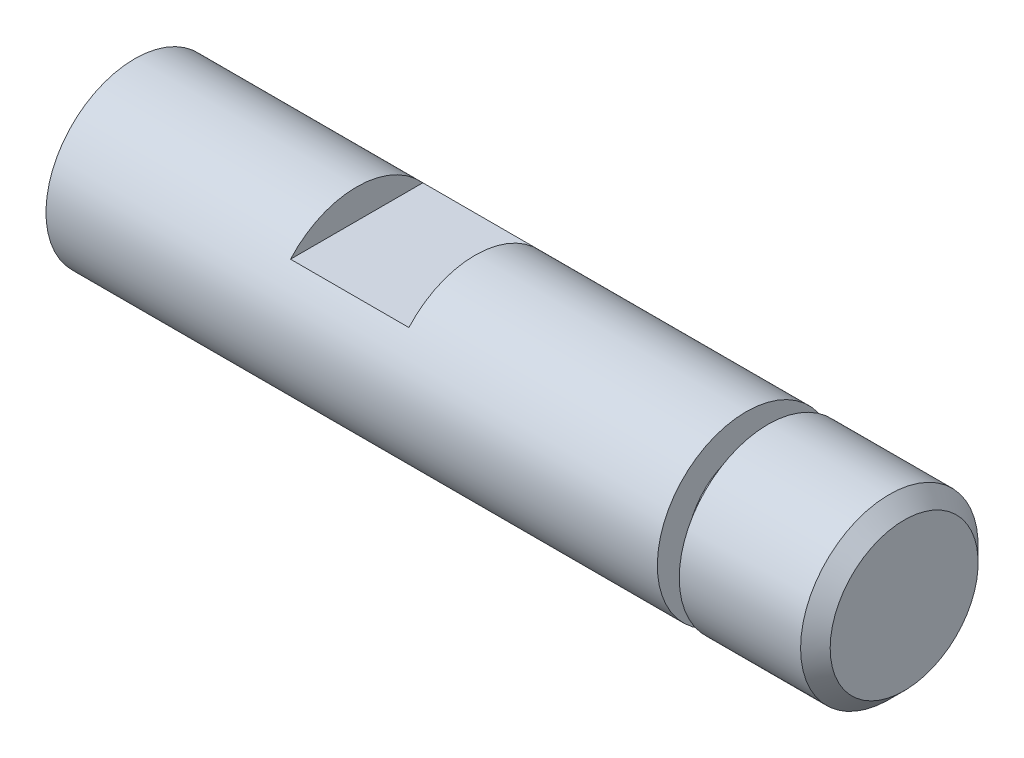
ISO-10303-21;
HEADER;
FILE_DESCRIPTION(('STEP AP214'),'2;1');
FILE_NAME('part.step','',(''),(''),'','','');
FILE_SCHEMA(('AUTOMOTIVE_DESIGN { 1 0 10303 214 1 1 1 1 }'));
ENDSEC;
DATA;
#1=APPLICATION_CONTEXT('core data for automotive mechanical design processes');
#2=APPLICATION_PROTOCOL_DEFINITION('international standard','automotive_design',2000,#1);
#3=PRODUCT_CONTEXT('',#1,'mechanical');
#4=PRODUCT('Part','Part','',(#3));
#5=PRODUCT_RELATED_PRODUCT_CATEGORY('part','',(#4));
#6=PRODUCT_DEFINITION_FORMATION('','',#4);
#7=PRODUCT_DEFINITION_CONTEXT('part definition',#1,'design');
#8=PRODUCT_DEFINITION('design','',#6,#7);
#9=PRODUCT_DEFINITION_SHAPE('','',#8);
#10=(LENGTH_UNIT() NAMED_UNIT(*) SI_UNIT(.MILLI.,.METRE.));
#11=(NAMED_UNIT(*) PLANE_ANGLE_UNIT() SI_UNIT($,.RADIAN.));
#12=(NAMED_UNIT(*) SI_UNIT($,.STERADIAN.) SOLID_ANGLE_UNIT());
#13=UNCERTAINTY_MEASURE_WITH_UNIT(LENGTH_MEASURE(1.E-05),#10,'distance_accuracy_value','');
#14=(GEOMETRIC_REPRESENTATION_CONTEXT(3) GLOBAL_UNCERTAINTY_ASSIGNED_CONTEXT((#13)) GLOBAL_UNIT_ASSIGNED_CONTEXT((#10,
#11,#12)) REPRESENTATION_CONTEXT('',''));
#15=CARTESIAN_POINT('',(0.,0.,0.));
#16=DIRECTION('',(0.,0.,1.));
#17=DIRECTION('',(1.,0.,0.));
#18=AXIS2_PLACEMENT_3D('',#15,#16,#17);
#19=CARTESIAN_POINT('',(0.,0.,0.));
#20=DIRECTION('',(-1.,0.,0.));
#21=DIRECTION('',(0.,0.,1.));
#22=AXIS2_PLACEMENT_3D('',#19,#20,#21);
#23=CYLINDRICAL_SURFACE('',#22,3.);
#24=CARTESIAN_POINT('',(20.66,0.,0.));
#25=DIRECTION('',(1.,0.,0.));
#26=DIRECTION('',(0.,1.,0.));
#27=AXIS2_PLACEMENT_3D('',#24,#25,#26);
#28=CIRCLE('',#27,3.);
#29=CARTESIAN_POINT('',(20.66,3.,0.));
#30=VERTEX_POINT('',#29);
#31=EDGE_CURVE('E82',#30,#30,#28,.T.);
#32=ORIENTED_EDGE('',*,*,#31,.F.);
#33=EDGE_LOOP('',(#32));
#34=FACE_BOUND('',#33,.T.);
#35=CARTESIAN_POINT('',(11.5,0.,0.));
#36=DIRECTION('',(-1.,0.,0.));
#37=DIRECTION('',(0.,0.,1.));
#38=AXIS2_PLACEMENT_3D('',#35,#36,#37);
#39=CIRCLE('',#38,3.);
#40=CARTESIAN_POINT('',(11.5,2.00000000000002,2.23606797749977));
#41=VERTEX_POINT('',#40);
#42=CARTESIAN_POINT('',(11.5,2.00000000000002,-2.23606797749977));
#43=VERTEX_POINT('',#42);
#44=EDGE_CURVE('E67',#41,#43,#39,.T.);
#45=ORIENTED_EDGE('',*,*,#44,.F.);
#46=DIRECTION('',(-1.,0.,0.));
#47=VECTOR('',#46,1.);
#48=CARTESIAN_POINT('',(0.,2.00000000000002,2.23606797749977));
#49=LINE('',#48,#47);
#50=CARTESIAN_POINT('',(7.5,2.00000000000002,2.23606797749977));
#51=VERTEX_POINT('',#50);
#52=EDGE_CURVE('E41',#41,#51,#49,.T.);
#53=ORIENTED_EDGE('',*,*,#52,.T.);
#54=CARTESIAN_POINT('',(7.5,0.,0.));
#55=DIRECTION('',(-1.,0.,0.));
#56=DIRECTION('',(0.,0.,1.));
#57=AXIS2_PLACEMENT_3D('',#54,#55,#56);
#58=CIRCLE('',#57,3.);
#59=CARTESIAN_POINT('',(7.5,2.00000000000002,-2.23606797749977));
#60=VERTEX_POINT('',#59);
#61=EDGE_CURVE('E55',#51,#60,#58,.T.);
#62=ORIENTED_EDGE('',*,*,#61,.T.);
#63=DIRECTION('',(-1.,0.,0.));
#64=VECTOR('',#63,1.);
#65=CARTESIAN_POINT('',(0.,2.00000000000002,-2.23606797749977));
#66=LINE('',#65,#64);
#67=EDGE_CURVE('E72',#60,#43,#66,.F.);
#68=ORIENTED_EDGE('',*,*,#67,.T.);
#69=EDGE_LOOP('',(#45,#53,#62,#68));
#70=FACE_BOUND('',#69,.T.);
#71=CARTESIAN_POINT('',(0.,0.,0.));
#72=DIRECTION('',(1.,0.,0.));
#73=DIRECTION('',(0.,1.,0.));
#74=AXIS2_PLACEMENT_3D('',#71,#72,#73);
#75=CIRCLE('',#74,3.);
#76=CARTESIAN_POINT('',(0.,3.,0.));
#77=VERTEX_POINT('',#76);
#78=EDGE_CURVE('E11',#77,#77,#75,.T.);
#79=ORIENTED_EDGE('',*,*,#78,.T.);
#80=EDGE_LOOP('',(#79));
#81=FACE_BOUND('',#80,.T.);
#82=ADVANCED_FACE('F33',(#34,#70,#81),#23,.T.);
#83=CARTESIAN_POINT('',(7.5,4.00000000000002,-3.));
#84=DIRECTION('',(-1.,0.,0.));
#85=DIRECTION('',(0.,0.,1.));
#86=AXIS2_PLACEMENT_3D('',#83,#84,#85);
#87=PLANE('',#86);
#88=DIRECTION('',(0.,0.,1.));
#89=VECTOR('',#88,1.);
#90=CARTESIAN_POINT('',(7.5,2.00000000000002,-3.));
#91=LINE('',#90,#89);
#92=EDGE_CURVE('E62',#60,#51,#91,.T.);
#93=ORIENTED_EDGE('',*,*,#92,.F.);
#94=ORIENTED_EDGE('',*,*,#61,.F.);
#95=EDGE_LOOP('',(#93,#94));
#96=FACE_BOUND('',#95,.T.);
#97=ADVANCED_FACE('F119',(#96),#87,.F.);
#98=CARTESIAN_POINT('',(11.5,4.00000000000002,-3.));
#99=DIRECTION('',(-1.,0.,0.));
#100=DIRECTION('',(0.,0.,1.));
#101=AXIS2_PLACEMENT_3D('',#98,#99,#100);
#102=PLANE('',#101);
#103=ORIENTED_EDGE('',*,*,#44,.T.);
#104=DIRECTION('',(0.,0.,1.));
#105=VECTOR('',#104,1.);
#106=CARTESIAN_POINT('',(11.5,2.00000000000002,-3.));
#107=LINE('',#106,#105);
#108=EDGE_CURVE('E48',#43,#41,#107,.T.);
#109=ORIENTED_EDGE('',*,*,#108,.T.);
#110=EDGE_LOOP('',(#103,#109));
#111=FACE_BOUND('',#110,.T.);
#112=ADVANCED_FACE('F66',(#111),#102,.T.);
#113=CARTESIAN_POINT('',(7.5,2.00000000000002,-3.));
#114=DIRECTION('',(0.,-1.,0.));
#115=DIRECTION('',(1.,0.,0.));
#116=AXIS2_PLACEMENT_3D('',#113,#114,#115);
#117=PLANE('',#116);
#118=ORIENTED_EDGE('',*,*,#108,.F.);
#119=ORIENTED_EDGE('',*,*,#67,.F.);
#120=ORIENTED_EDGE('',*,*,#92,.T.);
#121=ORIENTED_EDGE('',*,*,#52,.F.);
#122=EDGE_LOOP('',(#118,#119,#120,#121));
#123=FACE_BOUND('',#122,.T.);
#124=ADVANCED_FACE('F61',(#123),#117,.F.);
#125=CARTESIAN_POINT('',(20.66,3.,0.));
#126=DIRECTION('',(-1.,0.,0.));
#127=DIRECTION('',(0.,-1.,0.));
#128=AXIS2_PLACEMENT_3D('',#125,#126,#127);
#129=PLANE('',#128);
#130=CARTESIAN_POINT('',(20.66,0.,0.));
#131=DIRECTION('',(1.,0.,0.));
#132=DIRECTION('',(0.,1.,0.));
#133=AXIS2_PLACEMENT_3D('',#130,#131,#132);
#134=CIRCLE('',#133,1.99999999999999);
#135=CARTESIAN_POINT('',(20.66,2.,0.));
#136=VERTEX_POINT('',#135);
#137=EDGE_CURVE('E86',#136,#136,#134,.T.);
#138=ORIENTED_EDGE('',*,*,#137,.F.);
#139=EDGE_LOOP('',(#138));
#140=FACE_BOUND('',#139,.T.);
#141=ORIENTED_EDGE('',*,*,#31,.T.);
#142=EDGE_LOOP('',(#141));
#143=FACE_BOUND('',#142,.T.);
#144=ADVANCED_FACE('F109',(#140,#143),#129,.F.);
#145=CARTESIAN_POINT('',(0.,0.,0.));
#146=DIRECTION('',(1.,0.,0.));
#147=DIRECTION('',(0.,1.,0.));
#148=AXIS2_PLACEMENT_3D('',#145,#146,#147);
#149=CYLINDRICAL_SURFACE('',#148,1.99999999999999);
#150=CARTESIAN_POINT('',(21.4,0.,0.));
#151=DIRECTION('',(1.,0.,0.));
#152=DIRECTION('',(0.,1.,0.));
#153=AXIS2_PLACEMENT_3D('',#150,#151,#152);
#154=CIRCLE('',#153,1.99999999999999);
#155=CARTESIAN_POINT('',(21.4,2.,0.));
#156=VERTEX_POINT('',#155);
#157=EDGE_CURVE('E89',#156,#156,#154,.T.);
#158=ORIENTED_EDGE('',*,*,#157,.F.);
#159=EDGE_LOOP('',(#158));
#160=FACE_BOUND('',#159,.T.);
#161=ORIENTED_EDGE('',*,*,#137,.T.);
#162=EDGE_LOOP('',(#161));
#163=FACE_BOUND('',#162,.T.);
#164=ADVANCED_FACE('F103',(#160,#163),#149,.T.);
#165=CARTESIAN_POINT('',(21.4,3.,0.));
#166=DIRECTION('',(1.,0.,0.));
#167=DIRECTION('',(0.,1.,0.));
#168=AXIS2_PLACEMENT_3D('',#165,#166,#167);
#169=PLANE('',#168);
#170=CARTESIAN_POINT('',(21.4,0.,0.));
#171=DIRECTION('',(1.,0.,0.));
#172=DIRECTION('',(0.,1.,0.));
#173=AXIS2_PLACEMENT_3D('',#170,#171,#172);
#174=CIRCLE('',#173,3.);
#175=CARTESIAN_POINT('',(21.4,3.,0.));
#176=VERTEX_POINT('',#175);
#177=EDGE_CURVE('E92',#176,#176,#174,.T.);
#178=ORIENTED_EDGE('',*,*,#177,.F.);
#179=EDGE_LOOP('',(#178));
#180=FACE_BOUND('',#179,.T.);
#181=ORIENTED_EDGE('',*,*,#157,.T.);
#182=EDGE_LOOP('',(#181));
#183=FACE_BOUND('',#182,.T.);
#184=ADVANCED_FACE('F99',(#180,#183),#169,.F.);
#185=CARTESIAN_POINT('',(26.,0.,0.));
#186=DIRECTION('',(-1.,0.,0.));
#187=DIRECTION('',(0.,0.,1.));
#188=AXIS2_PLACEMENT_3D('',#185,#186,#187);
#189=PLANE('',#188);
#190=CARTESIAN_POINT('',(26.,0.,0.));
#191=DIRECTION('',(-1.,0.,0.));
#192=DIRECTION('',(0.,0.,1.));
#193=AXIS2_PLACEMENT_3D('',#190,#191,#192);
#194=CIRCLE('',#193,2.50000000000002);
#195=CARTESIAN_POINT('',(26.,0.,2.50000000000002));
#196=VERTEX_POINT('',#195);
#197=EDGE_CURVE('E75',#196,#196,#194,.F.);
#198=ORIENTED_EDGE('',*,*,#197,.T.);
#199=EDGE_LOOP('',(#198));
#200=FACE_BOUND('',#199,.T.);
#201=ADVANCED_FACE('F102',(#200),#189,.F.);
#202=CARTESIAN_POINT('',(25.5,0.,0.));
#203=DIRECTION('',(-1.,0.,0.));
#204=DIRECTION('',(0.,0.,1.));
#205=AXIS2_PLACEMENT_3D('',#202,#203,#204);
#206=CONICAL_SURFACE('',#205,3.,0.785398163397453);
#207=ORIENTED_EDGE('',*,*,#197,.F.);
#208=EDGE_LOOP('',(#207));
#209=FACE_BOUND('',#208,.T.);
#210=CARTESIAN_POINT('',(25.5,0.,0.));
#211=DIRECTION('',(-1.,0.,0.));
#212=DIRECTION('',(0.,0.,1.));
#213=AXIS2_PLACEMENT_3D('',#210,#211,#212);
#214=CIRCLE('',#213,3.);
#215=CARTESIAN_POINT('',(25.5,0.,3.));
#216=VERTEX_POINT('',#215);
#217=EDGE_CURVE('E69',#216,#216,#214,.T.);
#218=ORIENTED_EDGE('',*,*,#217,.F.);
#219=EDGE_LOOP('',(#218));
#220=FACE_BOUND('',#219,.T.);
#221=ADVANCED_FACE('F35',(#209,#220),#206,.T.);
#222=ORIENTED_EDGE('',*,*,#177,.T.);
#223=EDGE_LOOP('',(#222));
#224=FACE_BOUND('',#223,.T.);
#225=ORIENTED_EDGE('',*,*,#217,.T.);
#226=EDGE_LOOP('',(#225));
#227=FACE_BOUND('',#226,.T.);
#228=ADVANCED_FACE('F96',(#224,#227),#23,.T.);
#229=CARTESIAN_POINT('',(0.,11.2061033139604,-3.));
#230=DIRECTION('',(1.,0.,0.));
#231=DIRECTION('',(0.,1.,0.));
#232=AXIS2_PLACEMENT_3D('',#229,#230,#231);
#233=PLANE('',#232);
#234=ORIENTED_EDGE('',*,*,#78,.F.);
#235=EDGE_LOOP('',(#234));
#236=FACE_BOUND('',#235,.T.);
#237=ADVANCED_FACE('F126',(#236),#233,.F.);
#238=CLOSED_SHELL('',(#82,#97,#112,#124,#144,#164,#184,#201,#221,#228,#237));
#239=MANIFOLD_SOLID_BREP('B2',#238);
#240=ADVANCED_BREP_SHAPE_REPRESENTATION('',(#18,#239),#14);
#241=SHAPE_DEFINITION_REPRESENTATION(#9,#240);
ENDSEC;
END-ISO-10303-21;
